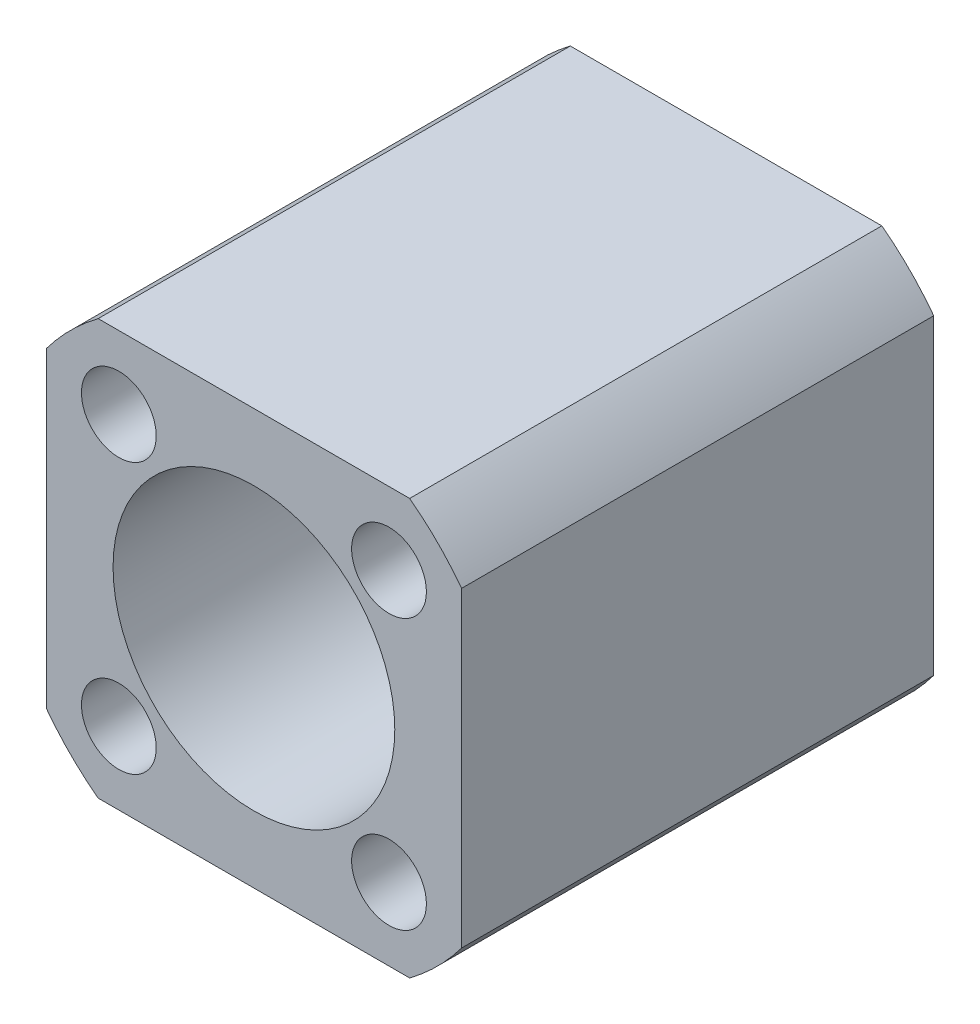
ISO-10303-21;
HEADER;
FILE_DESCRIPTION(('STEP AP214'),'2;1');
FILE_NAME('part.step','',(''),(''),'','','');
FILE_SCHEMA(('AUTOMOTIVE_DESIGN { 1 0 10303 214 1 1 1 1 }'));
ENDSEC;
DATA;
#1=APPLICATION_CONTEXT('core data for automotive mechanical design processes');
#2=APPLICATION_PROTOCOL_DEFINITION('international standard','automotive_design',2000,#1);
#3=PRODUCT_CONTEXT('',#1,'mechanical');
#4=PRODUCT('Part','Part','',(#3));
#5=PRODUCT_RELATED_PRODUCT_CATEGORY('part','',(#4));
#6=PRODUCT_DEFINITION_FORMATION('','',#4);
#7=PRODUCT_DEFINITION_CONTEXT('part definition',#1,'design');
#8=PRODUCT_DEFINITION('design','',#6,#7);
#9=PRODUCT_DEFINITION_SHAPE('','',#8);
#10=(LENGTH_UNIT() NAMED_UNIT(*) SI_UNIT(.MILLI.,.METRE.));
#11=(NAMED_UNIT(*) PLANE_ANGLE_UNIT() SI_UNIT($,.RADIAN.));
#12=(NAMED_UNIT(*) SI_UNIT($,.STERADIAN.) SOLID_ANGLE_UNIT());
#13=UNCERTAINTY_MEASURE_WITH_UNIT(LENGTH_MEASURE(1.E-05),#10,'distance_accuracy_value','');
#14=(GEOMETRIC_REPRESENTATION_CONTEXT(3) GLOBAL_UNCERTAINTY_ASSIGNED_CONTEXT((#13)) GLOBAL_UNIT_ASSIGNED_CONTEXT((#10,
#11,#12)) REPRESENTATION_CONTEXT('',''));
#15=CARTESIAN_POINT('',(0.,0.,0.));
#16=DIRECTION('',(0.,0.,1.));
#17=DIRECTION('',(1.,0.,0.));
#18=AXIS2_PLACEMENT_3D('',#15,#16,#17);
#19=CARTESIAN_POINT('',(50.,0.,113.684766056888));
#20=DIRECTION('',(-1.,0.,0.));
#21=DIRECTION('',(0.,0.,1.));
#22=AXIS2_PLACEMENT_3D('',#19,#20,#21);
#23=PLANE('',#22);
#24=DIRECTION('',(0.,1.,0.));
#25=VECTOR('',#24,1.);
#26=CARTESIAN_POINT('',(50.,0.,0.));
#27=LINE('',#26,#25);
#28=CARTESIAN_POINT('',(50.,-37.5,0.));
#29=VERTEX_POINT('',#28);
#30=CARTESIAN_POINT('',(50.,37.5,0.));
#31=VERTEX_POINT('',#30);
#32=EDGE_CURVE('E149',#29,#31,#27,.T.);
#33=ORIENTED_EDGE('',*,*,#32,.T.);
#34=DIRECTION('',(0.,0.,-1.));
#35=VECTOR('',#34,1.);
#36=CARTESIAN_POINT('',(50.,37.5,113.684766056888));
#37=LINE('',#36,#35);
#38=CARTESIAN_POINT('',(50.,37.5,113.684766056888));
#39=VERTEX_POINT('',#38);
#40=EDGE_CURVE('E11',#39,#31,#37,.T.);
#41=ORIENTED_EDGE('',*,*,#40,.F.);
#42=DIRECTION('',(0.,1.,0.));
#43=VECTOR('',#42,1.);
#44=CARTESIAN_POINT('',(50.,0.,113.684766056888));
#45=LINE('',#44,#43);
#46=CARTESIAN_POINT('',(50.,-37.5,113.684766056888));
#47=VERTEX_POINT('',#46);
#48=EDGE_CURVE('E203',#47,#39,#45,.T.);
#49=ORIENTED_EDGE('',*,*,#48,.F.);
#50=DIRECTION('',(0.,0.,-1.));
#51=VECTOR('',#50,1.);
#52=CARTESIAN_POINT('',(50.,-37.5,113.684766056888));
#53=LINE('',#52,#51);
#54=EDGE_CURVE('E133',#47,#29,#53,.T.);
#55=ORIENTED_EDGE('',*,*,#54,.T.);
#56=EDGE_LOOP('',(#33,#41,#49,#55));
#57=FACE_BOUND('',#56,.T.);
#58=ADVANCED_FACE('F39',(#57),#23,.F.);
#59=CARTESIAN_POINT('',(0.,0.,113.684766056888));
#60=DIRECTION('',(0.,0.,-1.));
#61=DIRECTION('',(-1.,0.,0.));
#62=AXIS2_PLACEMENT_3D('',#59,#60,#61);
#63=CYLINDRICAL_SURFACE('',#62,62.5);
#64=CARTESIAN_POINT('',(0.,0.,0.));
#65=DIRECTION('',(0.,0.,1.));
#66=DIRECTION('',(1.,0.,0.));
#67=AXIS2_PLACEMENT_3D('',#64,#65,#66);
#68=CIRCLE('',#67,62.5);
#69=CARTESIAN_POINT('',(37.5,50.,0.));
#70=VERTEX_POINT('',#69);
#71=EDGE_CURVE('E152',#31,#70,#68,.T.);
#72=ORIENTED_EDGE('',*,*,#71,.T.);
#73=DIRECTION('',(0.,0.,-1.));
#74=VECTOR('',#73,1.);
#75=CARTESIAN_POINT('',(37.5,50.,113.684766056888));
#76=LINE('',#75,#74);
#77=CARTESIAN_POINT('',(37.5,50.,113.684766056888));
#78=VERTEX_POINT('',#77);
#79=EDGE_CURVE('E49',#78,#70,#76,.T.);
#80=ORIENTED_EDGE('',*,*,#79,.F.);
#81=CARTESIAN_POINT('',(0.,0.,113.684766056888));
#82=DIRECTION('',(0.,0.,1.));
#83=DIRECTION('',(1.,0.,0.));
#84=AXIS2_PLACEMENT_3D('',#81,#82,#83);
#85=CIRCLE('',#84,62.5);
#86=EDGE_CURVE('E100',#39,#78,#85,.T.);
#87=ORIENTED_EDGE('',*,*,#86,.F.);
#88=ORIENTED_EDGE('',*,*,#40,.T.);
#89=EDGE_LOOP('',(#72,#80,#87,#88));
#90=FACE_BOUND('',#89,.T.);
#91=ADVANCED_FACE('F176',(#90),#63,.T.);
#92=CARTESIAN_POINT('',(0.,50.,113.684766056888));
#93=DIRECTION('',(0.,1.,0.));
#94=DIRECTION('',(0.,0.,1.));
#95=AXIS2_PLACEMENT_3D('',#92,#93,#94);
#96=PLANE('',#95);
#97=DIRECTION('',(1.,0.,0.));
#98=VECTOR('',#97,1.);
#99=CARTESIAN_POINT('',(0.,50.,0.));
#100=LINE('',#99,#98);
#101=CARTESIAN_POINT('',(-37.5,50.,0.));
#102=VERTEX_POINT('',#101);
#103=EDGE_CURVE('E155',#102,#70,#100,.T.);
#104=ORIENTED_EDGE('',*,*,#103,.F.);
#105=DIRECTION('',(0.,0.,-1.));
#106=VECTOR('',#105,1.);
#107=CARTESIAN_POINT('',(-37.5,50.,113.684766056888));
#108=LINE('',#107,#106);
#109=CARTESIAN_POINT('',(-37.5,50.,113.684766056888));
#110=VERTEX_POINT('',#109);
#111=EDGE_CURVE('E168',#110,#102,#108,.T.);
#112=ORIENTED_EDGE('',*,*,#111,.F.);
#113=DIRECTION('',(1.,0.,0.));
#114=VECTOR('',#113,1.);
#115=CARTESIAN_POINT('',(0.,50.,113.684766056888));
#116=LINE('',#115,#114);
#117=EDGE_CURVE('E175',#110,#78,#116,.T.);
#118=ORIENTED_EDGE('',*,*,#117,.T.);
#119=ORIENTED_EDGE('',*,*,#79,.T.);
#120=EDGE_LOOP('',(#104,#112,#118,#119));
#121=FACE_BOUND('',#120,.T.);
#122=ADVANCED_FACE('F173',(#121),#96,.T.);
#123=CARTESIAN_POINT('',(-50.,37.5,0.));
#124=VERTEX_POINT('',#123);
#125=EDGE_CURVE('E156',#102,#124,#68,.T.);
#126=ORIENTED_EDGE('',*,*,#125,.T.);
#127=DIRECTION('',(0.,0.,-1.));
#128=VECTOR('',#127,1.);
#129=CARTESIAN_POINT('',(-50.,37.5,113.684766056888));
#130=LINE('',#129,#128);
#131=CARTESIAN_POINT('',(-50.,37.5,113.684766056888));
#132=VERTEX_POINT('',#131);
#133=EDGE_CURVE('E166',#132,#124,#130,.T.);
#134=ORIENTED_EDGE('',*,*,#133,.F.);
#135=EDGE_CURVE('E123',#110,#132,#85,.T.);
#136=ORIENTED_EDGE('',*,*,#135,.F.);
#137=ORIENTED_EDGE('',*,*,#111,.T.);
#138=EDGE_LOOP('',(#126,#134,#136,#137));
#139=FACE_BOUND('',#138,.T.);
#140=ADVANCED_FACE('F222',(#139),#63,.T.);
#141=CARTESIAN_POINT('',(-50.,0.,113.684766056888));
#142=DIRECTION('',(-1.,0.,0.));
#143=DIRECTION('',(0.,0.,1.));
#144=AXIS2_PLACEMENT_3D('',#141,#142,#143);
#145=PLANE('',#144);
#146=DIRECTION('',(0.,1.,0.));
#147=VECTOR('',#146,1.);
#148=CARTESIAN_POINT('',(-50.,0.,0.));
#149=LINE('',#148,#147);
#150=CARTESIAN_POINT('',(-50.,-37.5,0.));
#151=VERTEX_POINT('',#150);
#152=EDGE_CURVE('E159',#151,#124,#149,.T.);
#153=ORIENTED_EDGE('',*,*,#152,.F.);
#154=DIRECTION('',(0.,0.,-1.));
#155=VECTOR('',#154,1.);
#156=CARTESIAN_POINT('',(-50.,-37.5,113.684766056888));
#157=LINE('',#156,#155);
#158=CARTESIAN_POINT('',(-50.,-37.5,113.684766056888));
#159=VERTEX_POINT('',#158);
#160=EDGE_CURVE('E128',#159,#151,#157,.T.);
#161=ORIENTED_EDGE('',*,*,#160,.F.);
#162=DIRECTION('',(0.,1.,0.));
#163=VECTOR('',#162,1.);
#164=CARTESIAN_POINT('',(-50.,0.,113.684766056888));
#165=LINE('',#164,#163);
#166=EDGE_CURVE('E120',#159,#132,#165,.T.);
#167=ORIENTED_EDGE('',*,*,#166,.T.);
#168=ORIENTED_EDGE('',*,*,#133,.T.);
#169=EDGE_LOOP('',(#153,#161,#167,#168));
#170=FACE_BOUND('',#169,.T.);
#171=ADVANCED_FACE('F206',(#170),#145,.T.);
#172=CARTESIAN_POINT('',(-37.5,-50.,0.));
#173=VERTEX_POINT('',#172);
#174=EDGE_CURVE('E127',#151,#173,#68,.T.);
#175=ORIENTED_EDGE('',*,*,#174,.T.);
#176=DIRECTION('',(0.,0.,-1.));
#177=VECTOR('',#176,1.);
#178=CARTESIAN_POINT('',(-37.5,-50.,113.684766056888));
#179=LINE('',#178,#177);
#180=CARTESIAN_POINT('',(-37.5,-50.,113.684766056888));
#181=VERTEX_POINT('',#180);
#182=EDGE_CURVE('E124',#181,#173,#179,.T.);
#183=ORIENTED_EDGE('',*,*,#182,.F.);
#184=EDGE_CURVE('E114',#159,#181,#85,.T.);
#185=ORIENTED_EDGE('',*,*,#184,.F.);
#186=ORIENTED_EDGE('',*,*,#160,.T.);
#187=EDGE_LOOP('',(#175,#183,#185,#186));
#188=FACE_BOUND('',#187,.T.);
#189=ADVANCED_FACE('F125',(#188),#63,.T.);
#190=CARTESIAN_POINT('',(0.,-50.,113.684766056888));
#191=DIRECTION('',(0.,1.,0.));
#192=DIRECTION('',(0.,0.,1.));
#193=AXIS2_PLACEMENT_3D('',#190,#191,#192);
#194=PLANE('',#193);
#195=DIRECTION('',(1.,0.,0.));
#196=VECTOR('',#195,1.);
#197=CARTESIAN_POINT('',(0.,-50.,0.));
#198=LINE('',#197,#196);
#199=CARTESIAN_POINT('',(37.5,-50.,0.));
#200=VERTEX_POINT('',#199);
#201=EDGE_CURVE('E86',#173,#200,#198,.T.);
#202=ORIENTED_EDGE('',*,*,#201,.T.);
#203=DIRECTION('',(0.,0.,-1.));
#204=VECTOR('',#203,1.);
#205=CARTESIAN_POINT('',(37.5,-50.,113.684766056888));
#206=LINE('',#205,#204);
#207=CARTESIAN_POINT('',(37.5,-50.,113.684766056888));
#208=VERTEX_POINT('',#207);
#209=EDGE_CURVE('E129',#208,#200,#206,.T.);
#210=ORIENTED_EDGE('',*,*,#209,.F.);
#211=DIRECTION('',(1.,0.,0.));
#212=VECTOR('',#211,1.);
#213=CARTESIAN_POINT('',(0.,-50.,113.684766056888));
#214=LINE('',#213,#212);
#215=EDGE_CURVE('E118',#181,#208,#214,.T.);
#216=ORIENTED_EDGE('',*,*,#215,.F.);
#217=ORIENTED_EDGE('',*,*,#182,.T.);
#218=EDGE_LOOP('',(#202,#210,#216,#217));
#219=FACE_BOUND('',#218,.T.);
#220=ADVANCED_FACE('F131',(#219),#194,.F.);
#221=CARTESIAN_POINT('',(-32.5269119345812,32.5269119345812,113.684766056888));
#222=DIRECTION('',(0.,0.,-1.));
#223=DIRECTION('',(-1.,0.,0.));
#224=AXIS2_PLACEMENT_3D('',#221,#222,#223);
#225=CYLINDRICAL_SURFACE('',#224,9.);
#226=CARTESIAN_POINT('',(-32.5269119345812,32.5269119345812,113.684766056888));
#227=DIRECTION('',(0.,0.,1.));
#228=DIRECTION('',(1.,0.,0.));
#229=AXIS2_PLACEMENT_3D('',#226,#227,#228);
#230=CIRCLE('',#229,9.);
#231=CARTESIAN_POINT('',(-23.5269119345812,32.5269119345812,113.684766056888));
#232=VERTEX_POINT('',#231);
#233=EDGE_CURVE('E200',#232,#232,#230,.T.);
#234=ORIENTED_EDGE('',*,*,#233,.T.);
#235=EDGE_LOOP('',(#234));
#236=FACE_BOUND('',#235,.T.);
#237=CARTESIAN_POINT('',(-32.5269119345812,32.5269119345812,0.));
#238=DIRECTION('',(0.,0.,1.));
#239=DIRECTION('',(1.,0.,0.));
#240=AXIS2_PLACEMENT_3D('',#237,#238,#239);
#241=CIRCLE('',#240,9.);
#242=CARTESIAN_POINT('',(-23.5269119345812,32.5269119345812,0.));
#243=VERTEX_POINT('',#242);
#244=EDGE_CURVE('E146',#243,#243,#241,.T.);
#245=ORIENTED_EDGE('',*,*,#244,.F.);
#246=EDGE_LOOP('',(#245));
#247=FACE_BOUND('',#246,.T.);
#248=ADVANCED_FACE('F231',(#236,#247),#225,.F.);
#249=CARTESIAN_POINT('',(32.5269119345812,32.5269119345812,113.684766056888));
#250=DIRECTION('',(0.,0.,-1.));
#251=DIRECTION('',(-1.,0.,0.));
#252=AXIS2_PLACEMENT_3D('',#249,#250,#251);
#253=CYLINDRICAL_SURFACE('',#252,9.00000000000055);
#254=CARTESIAN_POINT('',(32.5269119345812,32.5269119345812,113.684766056888));
#255=DIRECTION('',(0.,0.,1.));
#256=DIRECTION('',(1.,0.,0.));
#257=AXIS2_PLACEMENT_3D('',#254,#255,#256);
#258=CIRCLE('',#257,9.00000000000055);
#259=CARTESIAN_POINT('',(41.5269119345817,32.5269119345812,113.684766056888));
#260=VERTEX_POINT('',#259);
#261=EDGE_CURVE('E193',#260,#260,#258,.T.);
#262=ORIENTED_EDGE('',*,*,#261,.T.);
#263=EDGE_LOOP('',(#262));
#264=FACE_BOUND('',#263,.T.);
#265=CARTESIAN_POINT('',(32.5269119345812,32.5269119345812,0.));
#266=DIRECTION('',(0.,0.,1.));
#267=DIRECTION('',(1.,0.,0.));
#268=AXIS2_PLACEMENT_3D('',#265,#266,#267);
#269=CIRCLE('',#268,9.00000000000055);
#270=CARTESIAN_POINT('',(41.5269119345817,32.5269119345812,0.));
#271=VERTEX_POINT('',#270);
#272=EDGE_CURVE('E143',#271,#271,#269,.T.);
#273=ORIENTED_EDGE('',*,*,#272,.F.);
#274=EDGE_LOOP('',(#273));
#275=FACE_BOUND('',#274,.T.);
#276=ADVANCED_FACE('F234',(#264,#275),#253,.F.);
#277=CARTESIAN_POINT('',(32.5269119345812,-32.5269119345812,113.684766056888));
#278=DIRECTION('',(0.,0.,-1.));
#279=DIRECTION('',(-1.,0.,0.));
#280=AXIS2_PLACEMENT_3D('',#277,#278,#279);
#281=CYLINDRICAL_SURFACE('',#280,9.00000000000231);
#282=CARTESIAN_POINT('',(32.5269119345812,-32.5269119345812,113.684766056888));
#283=DIRECTION('',(0.,0.,1.));
#284=DIRECTION('',(1.,0.,0.));
#285=AXIS2_PLACEMENT_3D('',#282,#283,#284);
#286=CIRCLE('',#285,9.00000000000231);
#287=CARTESIAN_POINT('',(41.5269119345835,-32.5269119345812,113.684766056888));
#288=VERTEX_POINT('',#287);
#289=EDGE_CURVE('E188',#288,#288,#286,.T.);
#290=ORIENTED_EDGE('',*,*,#289,.T.);
#291=EDGE_LOOP('',(#290));
#292=FACE_BOUND('',#291,.T.);
#293=CARTESIAN_POINT('',(32.5269119345812,-32.5269119345812,0.));
#294=DIRECTION('',(0.,0.,1.));
#295=DIRECTION('',(1.,0.,0.));
#296=AXIS2_PLACEMENT_3D('',#293,#294,#295);
#297=CIRCLE('',#296,9.00000000000231);
#298=CARTESIAN_POINT('',(41.5269119345835,-32.5269119345812,0.));
#299=VERTEX_POINT('',#298);
#300=EDGE_CURVE('E140',#299,#299,#297,.T.);
#301=ORIENTED_EDGE('',*,*,#300,.F.);
#302=EDGE_LOOP('',(#301));
#303=FACE_BOUND('',#302,.T.);
#304=ADVANCED_FACE('F218',(#292,#303),#281,.F.);
#305=CARTESIAN_POINT('',(-32.5269119345812,-32.5269119345812,113.684766056888));
#306=DIRECTION('',(0.,0.,-1.));
#307=DIRECTION('',(-1.,0.,0.));
#308=AXIS2_PLACEMENT_3D('',#305,#306,#307);
#309=CYLINDRICAL_SURFACE('',#308,9.00000000000155);
#310=CARTESIAN_POINT('',(-32.5269119345812,-32.5269119345812,113.684766056888));
#311=DIRECTION('',(0.,0.,1.));
#312=DIRECTION('',(1.,0.,0.));
#313=AXIS2_PLACEMENT_3D('',#310,#311,#312);
#314=CIRCLE('',#313,9.00000000000155);
#315=CARTESIAN_POINT('',(-23.5269119345796,-32.5269119345812,113.684766056888));
#316=VERTEX_POINT('',#315);
#317=EDGE_CURVE('E186',#316,#316,#314,.T.);
#318=ORIENTED_EDGE('',*,*,#317,.T.);
#319=EDGE_LOOP('',(#318));
#320=FACE_BOUND('',#319,.T.);
#321=CARTESIAN_POINT('',(-32.5269119345812,-32.5269119345812,0.));
#322=DIRECTION('',(0.,0.,1.));
#323=DIRECTION('',(1.,0.,0.));
#324=AXIS2_PLACEMENT_3D('',#321,#322,#323);
#325=CIRCLE('',#324,9.00000000000155);
#326=CARTESIAN_POINT('',(-23.5269119345796,-32.5269119345812,0.));
#327=VERTEX_POINT('',#326);
#328=EDGE_CURVE('E137',#327,#327,#325,.T.);
#329=ORIENTED_EDGE('',*,*,#328,.F.);
#330=EDGE_LOOP('',(#329));
#331=FACE_BOUND('',#330,.T.);
#332=ADVANCED_FACE('F41',(#320,#331),#309,.F.);
#333=EDGE_CURVE('E92',#200,#29,#68,.T.);
#334=ORIENTED_EDGE('',*,*,#333,.T.);
#335=ORIENTED_EDGE('',*,*,#54,.F.);
#336=EDGE_CURVE('E57',#208,#47,#85,.T.);
#337=ORIENTED_EDGE('',*,*,#336,.F.);
#338=ORIENTED_EDGE('',*,*,#209,.T.);
#339=EDGE_LOOP('',(#334,#335,#337,#338));
#340=FACE_BOUND('',#339,.T.);
#341=ADVANCED_FACE('F209',(#340),#63,.T.);
#342=CARTESIAN_POINT('',(0.,0.,113.684766056888));
#343=DIRECTION('',(0.,0.,1.));
#344=DIRECTION('',(1.,0.,0.));
#345=AXIS2_PLACEMENT_3D('',#342,#343,#344);
#346=PLANE('',#345);
#347=CARTESIAN_POINT('',(0.,0.,113.684766056888));
#348=DIRECTION('',(0.,0.,1.));
#349=DIRECTION('',(1.,0.,0.));
#350=AXIS2_PLACEMENT_3D('',#347,#348,#349);
#351=CIRCLE('',#350,33.9177115178822);
#352=CARTESIAN_POINT('',(33.9177115178822,0.,113.684766056888));
#353=VERTEX_POINT('',#352);
#354=EDGE_CURVE('E196',#353,#353,#351,.T.);
#355=ORIENTED_EDGE('',*,*,#354,.F.);
#356=EDGE_LOOP('',(#355));
#357=FACE_BOUND('',#356,.T.);
#358=ORIENTED_EDGE('',*,*,#317,.F.);
#359=EDGE_LOOP('',(#358));
#360=FACE_BOUND('',#359,.T.);
#361=ORIENTED_EDGE('',*,*,#289,.F.);
#362=EDGE_LOOP('',(#361));
#363=FACE_BOUND('',#362,.T.);
#364=ORIENTED_EDGE('',*,*,#261,.F.);
#365=EDGE_LOOP('',(#364));
#366=FACE_BOUND('',#365,.T.);
#367=ORIENTED_EDGE('',*,*,#233,.F.);
#368=EDGE_LOOP('',(#367));
#369=FACE_BOUND('',#368,.T.);
#370=ORIENTED_EDGE('',*,*,#48,.T.);
#371=ORIENTED_EDGE('',*,*,#86,.T.);
#372=ORIENTED_EDGE('',*,*,#117,.F.);
#373=ORIENTED_EDGE('',*,*,#135,.T.);
#374=ORIENTED_EDGE('',*,*,#166,.F.);
#375=ORIENTED_EDGE('',*,*,#184,.T.);
#376=ORIENTED_EDGE('',*,*,#215,.T.);
#377=ORIENTED_EDGE('',*,*,#336,.T.);
#378=EDGE_LOOP('',(#370,#371,#372,#373,#374,#375,#376,#377));
#379=FACE_BOUND('',#378,.T.);
#380=ADVANCED_FACE('F116',(#357,#360,#363,#366,#369,#379),#346,.T.);
#381=CARTESIAN_POINT('',(0.,0.,0.));
#382=DIRECTION('',(0.,0.,1.));
#383=DIRECTION('',(1.,0.,0.));
#384=AXIS2_PLACEMENT_3D('',#381,#382,#383);
#385=PLANE('',#384);
#386=CARTESIAN_POINT('',(0.,0.,0.));
#387=DIRECTION('',(0.,0.,1.));
#388=DIRECTION('',(1.,0.,0.));
#389=AXIS2_PLACEMENT_3D('',#386,#387,#388);
#390=CIRCLE('',#389,33.9177115178822);
#391=CARTESIAN_POINT('',(33.9177115178822,0.,0.));
#392=VERTEX_POINT('',#391);
#393=EDGE_CURVE('E43',#392,#392,#390,.T.);
#394=ORIENTED_EDGE('',*,*,#393,.T.);
#395=EDGE_LOOP('',(#394));
#396=FACE_BOUND('',#395,.T.);
#397=ORIENTED_EDGE('',*,*,#328,.T.);
#398=EDGE_LOOP('',(#397));
#399=FACE_BOUND('',#398,.T.);
#400=ORIENTED_EDGE('',*,*,#300,.T.);
#401=EDGE_LOOP('',(#400));
#402=FACE_BOUND('',#401,.T.);
#403=ORIENTED_EDGE('',*,*,#272,.T.);
#404=EDGE_LOOP('',(#403));
#405=FACE_BOUND('',#404,.T.);
#406=ORIENTED_EDGE('',*,*,#244,.T.);
#407=EDGE_LOOP('',(#406));
#408=FACE_BOUND('',#407,.T.);
#409=ORIENTED_EDGE('',*,*,#32,.F.);
#410=ORIENTED_EDGE('',*,*,#333,.F.);
#411=ORIENTED_EDGE('',*,*,#201,.F.);
#412=ORIENTED_EDGE('',*,*,#174,.F.);
#413=ORIENTED_EDGE('',*,*,#152,.T.);
#414=ORIENTED_EDGE('',*,*,#125,.F.);
#415=ORIENTED_EDGE('',*,*,#103,.T.);
#416=ORIENTED_EDGE('',*,*,#71,.F.);
#417=EDGE_LOOP('',(#409,#410,#411,#412,#413,#414,#415,#416));
#418=FACE_BOUND('',#417,.T.);
#419=ADVANCED_FACE('F181',(#396,#399,#402,#405,#408,#418),#385,.F.);
#420=CARTESIAN_POINT('',(0.,0.,-50.1856636513341));
#421=DIRECTION('',(0.,0.,1.));
#422=DIRECTION('',(1.,0.,0.));
#423=AXIS2_PLACEMENT_3D('',#420,#421,#422);
#424=CYLINDRICAL_SURFACE('',#423,33.9177115178822);
#425=ORIENTED_EDGE('',*,*,#354,.T.);
#426=EDGE_LOOP('',(#425));
#427=FACE_BOUND('',#426,.T.);
#428=ORIENTED_EDGE('',*,*,#393,.F.);
#429=EDGE_LOOP('',(#428));
#430=FACE_BOUND('',#429,.T.);
#431=ADVANCED_FACE('F248',(#427,#430),#424,.F.);
#432=CLOSED_SHELL('',(#58,#91,#122,#140,#171,#189,#220,#248,#276,#304,#332,#341,#380,#419,#431));
#433=MANIFOLD_SOLID_BREP('B2',#432);
#434=ADVANCED_BREP_SHAPE_REPRESENTATION('',(#18,#433),#14);
#435=SHAPE_DEFINITION_REPRESENTATION(#9,#434);
ENDSEC;
END-ISO-10303-21;
